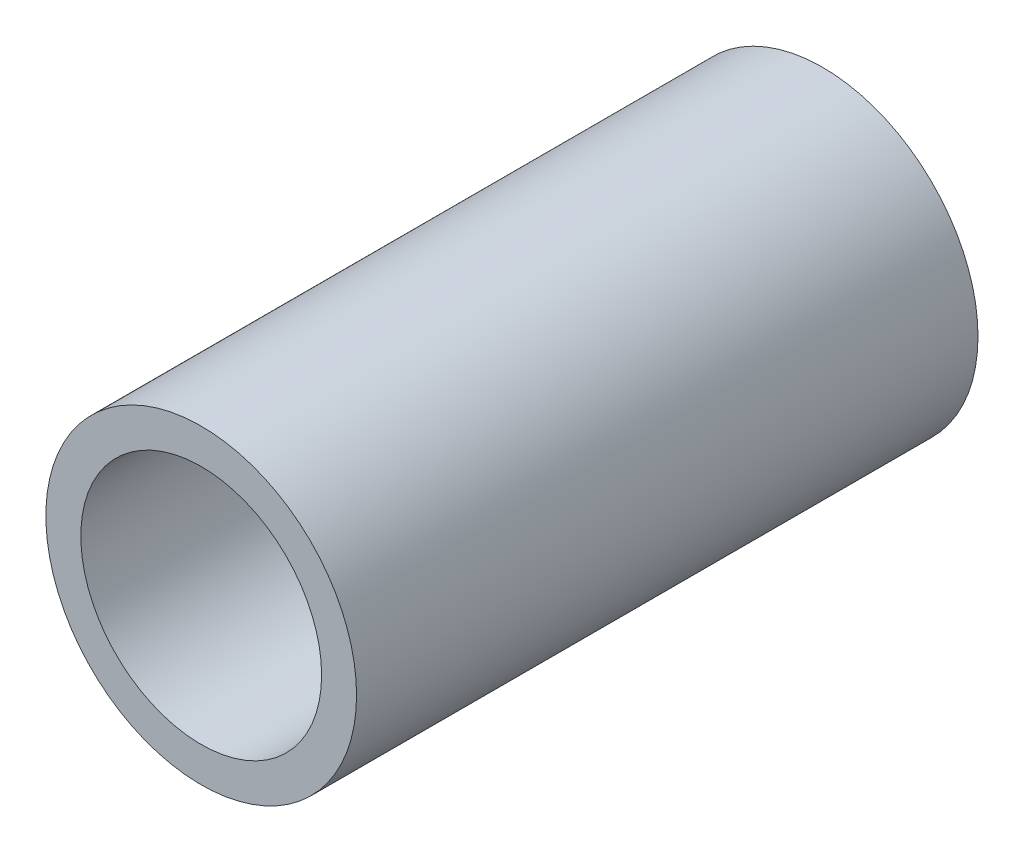
ISO-10303-21;
HEADER;
FILE_DESCRIPTION(('STEP AP214'),'2;1');
FILE_NAME('part.step','',(''),(''),'','','');
FILE_SCHEMA(('AUTOMOTIVE_DESIGN { 1 0 10303 214 1 1 1 1 }'));
ENDSEC;
DATA;
#1=APPLICATION_CONTEXT('core data for automotive mechanical design processes');
#2=APPLICATION_PROTOCOL_DEFINITION('international standard','automotive_design',2000,#1);
#3=PRODUCT_CONTEXT('',#1,'mechanical');
#4=PRODUCT('Part','Part','',(#3));
#5=PRODUCT_RELATED_PRODUCT_CATEGORY('part','',(#4));
#6=PRODUCT_DEFINITION_FORMATION('','',#4);
#7=PRODUCT_DEFINITION_CONTEXT('part definition',#1,'design');
#8=PRODUCT_DEFINITION('design','',#6,#7);
#9=PRODUCT_DEFINITION_SHAPE('','',#8);
#10=(LENGTH_UNIT() NAMED_UNIT(*) SI_UNIT(.MILLI.,.METRE.));
#11=(NAMED_UNIT(*) PLANE_ANGLE_UNIT() SI_UNIT($,.RADIAN.));
#12=(NAMED_UNIT(*) SI_UNIT($,.STERADIAN.) SOLID_ANGLE_UNIT());
#13=UNCERTAINTY_MEASURE_WITH_UNIT(LENGTH_MEASURE(1.E-05),#10,'distance_accuracy_value','');
#14=(GEOMETRIC_REPRESENTATION_CONTEXT(3) GLOBAL_UNCERTAINTY_ASSIGNED_CONTEXT((#13)) GLOBAL_UNIT_ASSIGNED_CONTEXT((#10,
#11,#12)) REPRESENTATION_CONTEXT('',''));
#15=CARTESIAN_POINT('',(0.,0.,0.));
#16=DIRECTION('',(0.,0.,1.));
#17=DIRECTION('',(1.,0.,0.));
#18=AXIS2_PLACEMENT_3D('',#15,#16,#17);
#19=CARTESIAN_POINT('',(0.,0.,4.));
#20=DIRECTION('',(0.,0.,1.));
#21=DIRECTION('',(1.,0.,0.));
#22=AXIS2_PLACEMENT_3D('',#19,#20,#21);
#23=PLANE('',#22);
#24=CARTESIAN_POINT('',(0.,0.,4.));
#25=DIRECTION('',(0.,0.,1.));
#26=DIRECTION('',(1.,0.,0.));
#27=AXIS2_PLACEMENT_3D('',#24,#25,#26);
#28=CIRCLE('',#27,1.);
#29=CARTESIAN_POINT('',(1.,0.,4.));
#30=VERTEX_POINT('',#29);
#31=EDGE_CURVE('E10',#30,#30,#28,.T.);
#32=ORIENTED_EDGE('',*,*,#31,.T.);
#33=EDGE_LOOP('',(#32));
#34=FACE_BOUND('',#33,.T.);
#35=CARTESIAN_POINT('',(0.,0.,4.));
#36=DIRECTION('',(0.,0.,1.));
#37=DIRECTION('',(1.,0.,0.));
#38=AXIS2_PLACEMENT_3D('',#35,#36,#37);
#39=CIRCLE('',#38,0.775);
#40=CARTESIAN_POINT('',(0.775,0.,4.));
#41=VERTEX_POINT('',#40);
#42=EDGE_CURVE('E46',#41,#41,#39,.T.);
#43=ORIENTED_EDGE('',*,*,#42,.F.);
#44=EDGE_LOOP('',(#43));
#45=FACE_BOUND('',#44,.T.);
#46=ADVANCED_FACE('F35',(#34,#45),#23,.T.);
#47=CARTESIAN_POINT('',(0.,0.,0.));
#48=DIRECTION('',(0.,0.,1.));
#49=DIRECTION('',(1.,0.,0.));
#50=AXIS2_PLACEMENT_3D('',#47,#48,#49);
#51=PLANE('',#50);
#52=CARTESIAN_POINT('',(0.,0.,0.));
#53=DIRECTION('',(0.,0.,1.));
#54=DIRECTION('',(1.,0.,0.));
#55=AXIS2_PLACEMENT_3D('',#52,#53,#54);
#56=CIRCLE('',#55,1.);
#57=CARTESIAN_POINT('',(1.,0.,0.));
#58=VERTEX_POINT('',#57);
#59=EDGE_CURVE('E39',#58,#58,#56,.T.);
#60=ORIENTED_EDGE('',*,*,#59,.F.);
#61=EDGE_LOOP('',(#60));
#62=FACE_BOUND('',#61,.T.);
#63=CARTESIAN_POINT('',(0.,0.,0.));
#64=DIRECTION('',(0.,0.,1.));
#65=DIRECTION('',(1.,0.,0.));
#66=AXIS2_PLACEMENT_3D('',#63,#64,#65);
#67=CIRCLE('',#66,0.775);
#68=CARTESIAN_POINT('',(0.775,0.,0.));
#69=VERTEX_POINT('',#68);
#70=EDGE_CURVE('E48',#69,#69,#67,.T.);
#71=ORIENTED_EDGE('',*,*,#70,.T.);
#72=EDGE_LOOP('',(#71));
#73=FACE_BOUND('',#72,.T.);
#74=ADVANCED_FACE('F58',(#62,#73),#51,.F.);
#75=CARTESIAN_POINT('',(0.,0.,4.));
#76=DIRECTION('',(0.,0.,-1.));
#77=DIRECTION('',(-1.,0.,0.));
#78=AXIS2_PLACEMENT_3D('',#75,#76,#77);
#79=CYLINDRICAL_SURFACE('',#78,1.);
#80=ORIENTED_EDGE('',*,*,#31,.F.);
#81=EDGE_LOOP('',(#80));
#82=FACE_BOUND('',#81,.T.);
#83=ORIENTED_EDGE('',*,*,#59,.T.);
#84=EDGE_LOOP('',(#83));
#85=FACE_BOUND('',#84,.T.);
#86=ADVANCED_FACE('F37',(#82,#85),#79,.T.);
#87=CARTESIAN_POINT('',(0.,0.,4.));
#88=DIRECTION('',(0.,0.,-1.));
#89=DIRECTION('',(-1.,0.,0.));
#90=AXIS2_PLACEMENT_3D('',#87,#88,#89);
#91=CYLINDRICAL_SURFACE('',#90,0.775);
#92=ORIENTED_EDGE('',*,*,#42,.T.);
#93=EDGE_LOOP('',(#92));
#94=FACE_BOUND('',#93,.T.);
#95=ORIENTED_EDGE('',*,*,#70,.F.);
#96=EDGE_LOOP('',(#95));
#97=FACE_BOUND('',#96,.T.);
#98=ADVANCED_FACE('F54',(#94,#97),#91,.F.);
#99=CLOSED_SHELL('',(#46,#74,#86,#98));
#100=MANIFOLD_SOLID_BREP('B2',#99);
#101=ADVANCED_BREP_SHAPE_REPRESENTATION('',(#18,#100),#14);
#102=SHAPE_DEFINITION_REPRESENTATION(#9,#101);
ENDSEC;
END-ISO-10303-21;
